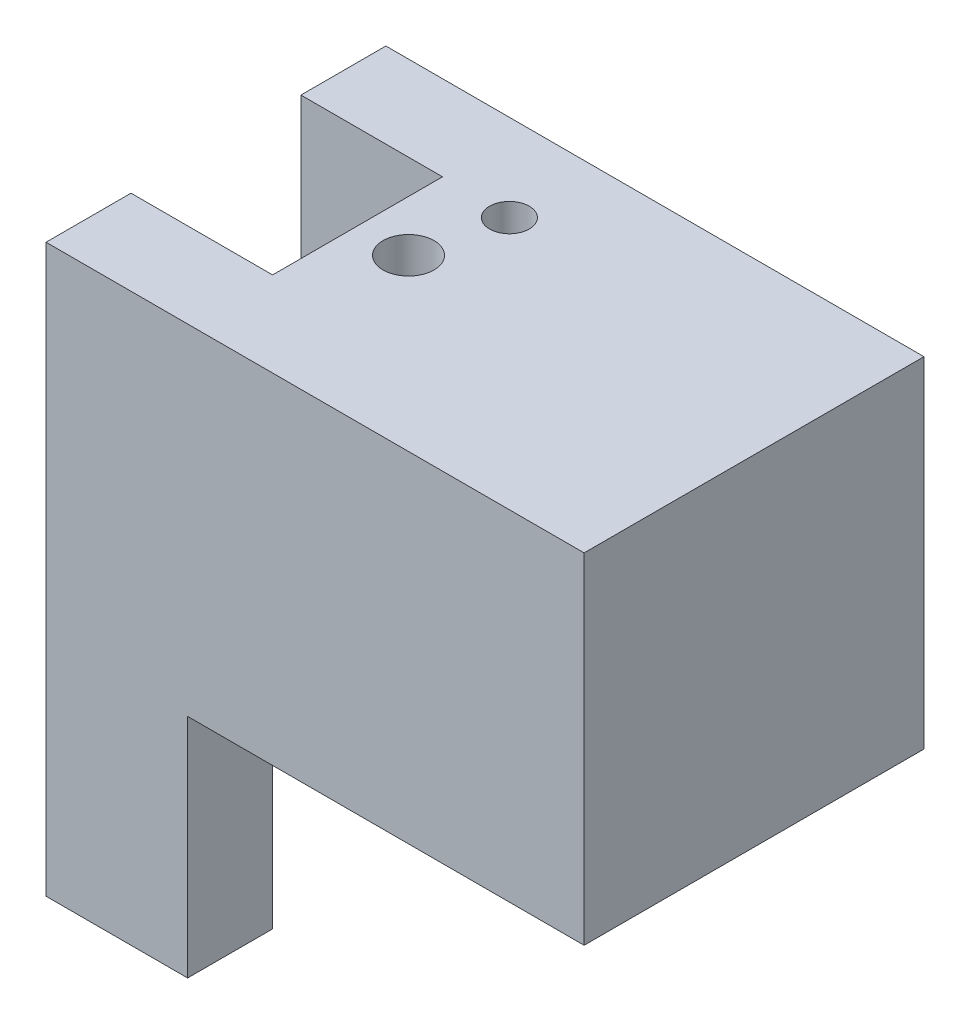
ISO-10303-21;
HEADER;
FILE_DESCRIPTION(('STEP AP214'),'2;1');
FILE_NAME('part.step','',(''),(''),'','','');
FILE_SCHEMA(('AUTOMOTIVE_DESIGN { 1 0 10303 214 1 1 1 1 }'));
ENDSEC;
DATA;
#1=APPLICATION_CONTEXT('core data for automotive mechanical design processes');
#2=APPLICATION_PROTOCOL_DEFINITION('international standard','automotive_design',2000,#1);
#3=PRODUCT_CONTEXT('',#1,'mechanical');
#4=PRODUCT('Part','Part','',(#3));
#5=PRODUCT_RELATED_PRODUCT_CATEGORY('part','',(#4));
#6=PRODUCT_DEFINITION_FORMATION('','',#4);
#7=PRODUCT_DEFINITION_CONTEXT('part definition',#1,'design');
#8=PRODUCT_DEFINITION('design','',#6,#7);
#9=PRODUCT_DEFINITION_SHAPE('','',#8);
#10=(LENGTH_UNIT() NAMED_UNIT(*) SI_UNIT(.MILLI.,.METRE.));
#11=(NAMED_UNIT(*) PLANE_ANGLE_UNIT() SI_UNIT($,.RADIAN.));
#12=(NAMED_UNIT(*) SI_UNIT($,.STERADIAN.) SOLID_ANGLE_UNIT());
#13=UNCERTAINTY_MEASURE_WITH_UNIT(LENGTH_MEASURE(1.E-05),#10,'distance_accuracy_value','');
#14=(GEOMETRIC_REPRESENTATION_CONTEXT(3) GLOBAL_UNCERTAINTY_ASSIGNED_CONTEXT((#13)) GLOBAL_UNIT_ASSIGNED_CONTEXT((#10,
#11,#12)) REPRESENTATION_CONTEXT('',''));
#15=CARTESIAN_POINT('',(0.,0.,0.));
#16=DIRECTION('',(0.,0.,1.));
#17=DIRECTION('',(1.,0.,0.));
#18=AXIS2_PLACEMENT_3D('',#15,#16,#17);
#19=CARTESIAN_POINT('',(-73.0526172288944,17.3879194630873,60.));
#20=DIRECTION('',(0.,1.,0.));
#21=DIRECTION('',(0.,0.,1.));
#22=AXIS2_PLACEMENT_3D('',#19,#20,#21);
#23=PLANE('',#22);
#24=CARTESIAN_POINT('',(-64.0526172288944,17.3879194630873,30.));
#25=DIRECTION('',(0.,-1.,0.));
#26=DIRECTION('',(0.,0.,-1.));
#27=AXIS2_PLACEMENT_3D('',#24,#25,#26);
#28=CIRCLE('',#27,4.5);
#29=CARTESIAN_POINT('',(-64.0526172288944,17.3879194630873,25.5));
#30=VERTEX_POINT('',#29);
#31=EDGE_CURVE('E270',#30,#30,#28,.T.);
#32=ORIENTED_EDGE('',*,*,#31,.F.);
#33=EDGE_LOOP('',(#32));
#34=FACE_BOUND('',#33,.T.);
#35=DIRECTION('',(0.,0.,1.));
#36=VECTOR('',#35,1.);
#37=CARTESIAN_POINT('',(-73.0526172288944,17.3879194630873,15.));
#38=LINE('',#37,#36);
#39=CARTESIAN_POINT('',(-73.0526172288944,17.3879194630873,0.));
#40=VERTEX_POINT('',#39);
#41=CARTESIAN_POINT('',(-73.0526172288944,17.3879194630873,15.));
#42=VERTEX_POINT('',#41);
#43=EDGE_CURVE('E195',#40,#42,#38,.T.);
#44=ORIENTED_EDGE('',*,*,#43,.F.);
#45=DIRECTION('',(1.,0.,0.));
#46=VECTOR('',#45,1.);
#47=CARTESIAN_POINT('',(-73.0526172288944,17.3879194630873,0.));
#48=LINE('',#47,#46);
#49=CARTESIAN_POINT('',(-3.05261722889438,17.3879194630873,0.));
#50=VERTEX_POINT('',#49);
#51=EDGE_CURVE('E67',#40,#50,#48,.T.);
#52=ORIENTED_EDGE('',*,*,#51,.T.);
#53=DIRECTION('',(0.,0.,-1.));
#54=VECTOR('',#53,1.);
#55=CARTESIAN_POINT('',(-3.05261722889438,17.3879194630873,60.));
#56=LINE('',#55,#54);
#57=CARTESIAN_POINT('',(-3.05261722889438,17.3879194630873,60.));
#58=VERTEX_POINT('',#57);
#59=EDGE_CURVE('E47',#58,#50,#56,.T.);
#60=ORIENTED_EDGE('',*,*,#59,.F.);
#61=DIRECTION('',(1.,0.,0.));
#62=VECTOR('',#61,1.);
#63=CARTESIAN_POINT('',(-73.0526172288944,17.3879194630873,60.));
#64=LINE('',#63,#62);
#65=CARTESIAN_POINT('',(-73.0526172288944,17.3879194630873,60.));
#66=VERTEX_POINT('',#65);
#67=EDGE_CURVE('E115',#66,#58,#64,.T.);
#68=ORIENTED_EDGE('',*,*,#67,.F.);
#69=DIRECTION('',(0.,0.,1.));
#70=VECTOR('',#69,1.);
#71=CARTESIAN_POINT('',(-73.0526172288944,17.3879194630873,60.));
#72=LINE('',#71,#70);
#73=CARTESIAN_POINT('',(-73.0526172288944,17.3879194630873,45.));
#74=VERTEX_POINT('',#73);
#75=EDGE_CURVE('E110',#74,#66,#72,.T.);
#76=ORIENTED_EDGE('',*,*,#75,.F.);
#77=DIRECTION('',(0.,0.,-1.));
#78=VECTOR('',#77,1.);
#79=CARTESIAN_POINT('',(-73.0526172288944,17.3879194630873,60.));
#80=LINE('',#79,#78);
#81=EDGE_CURVE('E11',#74,#42,#80,.T.);
#82=ORIENTED_EDGE('',*,*,#81,.T.);
#83=EDGE_LOOP('',(#44,#52,#60,#68,#76,#82));
#84=FACE_BOUND('',#83,.T.);
#85=ADVANCED_FACE('F37',(#34,#84),#23,.F.);
#86=CARTESIAN_POINT('',(-73.0526172288944,77.3879194630872,60.));
#87=DIRECTION('',(1.,0.,0.));
#88=DIRECTION('',(0.,1.,0.));
#89=AXIS2_PLACEMENT_3D('',#86,#87,#88);
#90=PLANE('',#89);
#91=DIRECTION('',(0.,-1.,0.));
#92=VECTOR('',#91,1.);
#93=CARTESIAN_POINT('',(-73.0526172288944,77.3879194630872,45.));
#94=LINE('',#93,#92);
#95=CARTESIAN_POINT('',(-73.0526172288944,77.3879194630872,45.));
#96=VERTEX_POINT('',#95);
#97=EDGE_CURVE('E125',#96,#74,#94,.T.);
#98=ORIENTED_EDGE('',*,*,#97,.F.);
#99=DIRECTION('',(0.,0.,-1.));
#100=VECTOR('',#99,1.);
#101=CARTESIAN_POINT('',(-73.0526172288944,77.3879194630872,60.));
#102=LINE('',#101,#100);
#103=CARTESIAN_POINT('',(-73.0526172288944,77.3879194630872,15.));
#104=VERTEX_POINT('',#103);
#105=EDGE_CURVE('E89',#96,#104,#102,.T.);
#106=ORIENTED_EDGE('',*,*,#105,.T.);
#107=DIRECTION('',(0.,1.,0.));
#108=VECTOR('',#107,1.);
#109=CARTESIAN_POINT('',(-73.0526172288944,77.3879194630872,15.));
#110=LINE('',#109,#108);
#111=EDGE_CURVE('E135',#42,#104,#110,.T.);
#112=ORIENTED_EDGE('',*,*,#111,.F.);
#113=ORIENTED_EDGE('',*,*,#81,.F.);
#114=EDGE_LOOP('',(#98,#106,#112,#113));
#115=FACE_BOUND('',#114,.T.);
#116=ADVANCED_FACE('F39',(#115),#90,.F.);
#117=CARTESIAN_POINT('',(-3.05261722889438,77.3879194630872,60.));
#118=DIRECTION('',(-1.,0.,0.));
#119=DIRECTION('',(0.,0.,1.));
#120=AXIS2_PLACEMENT_3D('',#117,#118,#119);
#121=PLANE('',#120);
#122=DIRECTION('',(0.,1.,0.));
#123=VECTOR('',#122,1.);
#124=CARTESIAN_POINT('',(-3.05261722889438,77.3879194630872,0.));
#125=LINE('',#124,#123);
#126=CARTESIAN_POINT('',(-3.05261722889438,77.3879194630872,0.));
#127=VERTEX_POINT('',#126);
#128=EDGE_CURVE('E184',#50,#127,#125,.T.);
#129=ORIENTED_EDGE('',*,*,#128,.T.);
#130=DIRECTION('',(0.,0.,-1.));
#131=VECTOR('',#130,1.);
#132=CARTESIAN_POINT('',(-3.05261722889438,77.3879194630872,60.));
#133=LINE('',#132,#131);
#134=CARTESIAN_POINT('',(-3.05261722889438,77.3879194630872,60.));
#135=VERTEX_POINT('',#134);
#136=EDGE_CURVE('E174',#135,#127,#133,.T.);
#137=ORIENTED_EDGE('',*,*,#136,.F.);
#138=DIRECTION('',(0.,1.,0.));
#139=VECTOR('',#138,1.);
#140=CARTESIAN_POINT('',(-3.05261722889438,77.3879194630872,60.));
#141=LINE('',#140,#139);
#142=EDGE_CURVE('E56',#58,#135,#141,.T.);
#143=ORIENTED_EDGE('',*,*,#142,.F.);
#144=ORIENTED_EDGE('',*,*,#59,.T.);
#145=EDGE_LOOP('',(#129,#137,#143,#144));
#146=FACE_BOUND('',#145,.T.);
#147=ADVANCED_FACE('F183',(#146),#121,.F.);
#148=CARTESIAN_POINT('',(-73.0526172288944,77.3879194630872,60.));
#149=DIRECTION('',(0.,-1.,0.));
#150=DIRECTION('',(0.,0.,-1.));
#151=AXIS2_PLACEMENT_3D('',#148,#149,#150);
#152=PLANE('',#151);
#153=CARTESIAN_POINT('',(-64.0526172288944,77.3879194630872,30.));
#154=DIRECTION('',(0.,-1.,0.));
#155=DIRECTION('',(0.,0.,-1.));
#156=AXIS2_PLACEMENT_3D('',#153,#154,#155);
#157=CIRCLE('',#156,4.5);
#158=CARTESIAN_POINT('',(-64.0526172288944,77.3879194630872,25.5));
#159=VERTEX_POINT('',#158);
#160=EDGE_CURVE('E428',#159,#159,#157,.F.);
#161=ORIENTED_EDGE('',*,*,#160,.F.);
#162=EDGE_LOOP('',(#161));
#163=FACE_BOUND('',#162,.T.);
#164=CARTESIAN_POINT('',(-60.9092010326515,77.3879194630872,15.3344850698618));
#165=DIRECTION('',(0.,1.,0.));
#166=DIRECTION('',(0.,0.,1.));
#167=AXIS2_PLACEMENT_3D('',#164,#165,#166);
#168=CIRCLE('',#167,3.5);
#169=CARTESIAN_POINT('',(-60.9092010326515,77.3879194630872,18.8344850698618));
#170=VERTEX_POINT('',#169);
#171=EDGE_CURVE('E267',#170,#170,#168,.T.);
#172=ORIENTED_EDGE('',*,*,#171,.F.);
#173=EDGE_LOOP('',(#172));
#174=FACE_BOUND('',#173,.T.);
#175=DIRECTION('',(-1.,0.,0.));
#176=VECTOR('',#175,1.);
#177=CARTESIAN_POINT('',(-73.0526172288944,77.3879194630872,0.));
#178=LINE('',#177,#176);
#179=CARTESIAN_POINT('',(-98.0526172288944,77.3879194630872,0.));
#180=VERTEX_POINT('',#179);
#181=EDGE_CURVE('E77',#127,#180,#178,.T.);
#182=ORIENTED_EDGE('',*,*,#181,.T.);
#183=DIRECTION('',(0.,0.,-1.));
#184=VECTOR('',#183,1.);
#185=CARTESIAN_POINT('',(-98.0526172288944,77.3879194630872,0.));
#186=LINE('',#185,#184);
#187=CARTESIAN_POINT('',(-98.0526172288944,77.3879194630872,15.));
#188=VERTEX_POINT('',#187);
#189=EDGE_CURVE('E157',#188,#180,#186,.T.);
#190=ORIENTED_EDGE('',*,*,#189,.F.);
#191=DIRECTION('',(1.,0.,0.));
#192=VECTOR('',#191,1.);
#193=CARTESIAN_POINT('',(-98.0526172288944,77.3879194630872,15.));
#194=LINE('',#193,#192);
#195=EDGE_CURVE('E159',#188,#104,#194,.T.);
#196=ORIENTED_EDGE('',*,*,#195,.T.);
#197=ORIENTED_EDGE('',*,*,#105,.F.);
#198=DIRECTION('',(1.,0.,0.));
#199=VECTOR('',#198,1.);
#200=CARTESIAN_POINT('',(-98.0526172288944,77.3879194630872,45.));
#201=LINE('',#200,#199);
#202=CARTESIAN_POINT('',(-98.0526172288944,77.3879194630872,45.));
#203=VERTEX_POINT('',#202);
#204=EDGE_CURVE('E132',#203,#96,#201,.T.);
#205=ORIENTED_EDGE('',*,*,#204,.F.);
#206=DIRECTION('',(0.,0.,-1.));
#207=VECTOR('',#206,1.);
#208=CARTESIAN_POINT('',(-98.0526172288944,77.3879194630872,60.));
#209=LINE('',#208,#207);
#210=CARTESIAN_POINT('',(-98.0526172288944,77.3879194630872,60.));
#211=VERTEX_POINT('',#210);
#212=EDGE_CURVE('E98',#211,#203,#209,.T.);
#213=ORIENTED_EDGE('',*,*,#212,.F.);
#214=DIRECTION('',(-1.,0.,0.));
#215=VECTOR('',#214,1.);
#216=CARTESIAN_POINT('',(-73.0526172288944,77.3879194630872,60.));
#217=LINE('',#216,#215);
#218=EDGE_CURVE('E175',#135,#211,#217,.T.);
#219=ORIENTED_EDGE('',*,*,#218,.F.);
#220=ORIENTED_EDGE('',*,*,#136,.T.);
#221=EDGE_LOOP('',(#182,#190,#196,#197,#205,#213,#219,#220));
#222=FACE_BOUND('',#221,.T.);
#223=ADVANCED_FACE('F297',(#163,#174,#222),#152,.F.);
#224=CARTESIAN_POINT('',(-73.0526172288944,17.3879194630873,60.));
#225=DIRECTION('',(0.,0.,1.));
#226=DIRECTION('',(1.,0.,0.));
#227=AXIS2_PLACEMENT_3D('',#224,#225,#226);
#228=PLANE('',#227);
#229=ORIENTED_EDGE('',*,*,#218,.T.);
#230=DIRECTION('',(0.,1.,0.));
#231=VECTOR('',#230,1.);
#232=CARTESIAN_POINT('',(-98.0526172288944,77.3879194630872,60.));
#233=LINE('',#232,#231);
#234=CARTESIAN_POINT('',(-98.0526172288944,-22.6120805369127,60.));
#235=VERTEX_POINT('',#234);
#236=EDGE_CURVE('E133',#235,#211,#233,.T.);
#237=ORIENTED_EDGE('',*,*,#236,.F.);
#238=DIRECTION('',(-1.,0.,0.));
#239=VECTOR('',#238,1.);
#240=CARTESIAN_POINT('',(-98.0526172288944,-22.6120805369127,60.));
#241=LINE('',#240,#239);
#242=CARTESIAN_POINT('',(-73.0526172288944,-22.6120805369127,60.));
#243=VERTEX_POINT('',#242);
#244=EDGE_CURVE('E141',#243,#235,#241,.T.);
#245=ORIENTED_EDGE('',*,*,#244,.F.);
#246=DIRECTION('',(0.,1.,0.));
#247=VECTOR('',#246,1.);
#248=CARTESIAN_POINT('',(-73.0526172288944,-22.6120805369127,60.));
#249=LINE('',#248,#247);
#250=EDGE_CURVE('E139',#243,#66,#249,.T.);
#251=ORIENTED_EDGE('',*,*,#250,.T.);
#252=ORIENTED_EDGE('',*,*,#67,.T.);
#253=ORIENTED_EDGE('',*,*,#142,.T.);
#254=EDGE_LOOP('',(#229,#237,#245,#251,#252,#253));
#255=FACE_BOUND('',#254,.T.);
#256=ADVANCED_FACE('F285',(#255),#228,.T.);
#257=CARTESIAN_POINT('',(-73.0526172288944,17.3879194630873,0.));
#258=DIRECTION('',(0.,0.,1.));
#259=DIRECTION('',(1.,0.,0.));
#260=AXIS2_PLACEMENT_3D('',#257,#258,#259);
#261=PLANE('',#260);
#262=ORIENTED_EDGE('',*,*,#51,.F.);
#263=DIRECTION('',(0.,1.,0.));
#264=VECTOR('',#263,1.);
#265=CARTESIAN_POINT('',(-73.0526172288944,-22.6120805369127,0.));
#266=LINE('',#265,#264);
#267=CARTESIAN_POINT('',(-73.0526172288944,-22.6120805369127,0.));
#268=VERTEX_POINT('',#267);
#269=EDGE_CURVE('E121',#268,#40,#266,.T.);
#270=ORIENTED_EDGE('',*,*,#269,.F.);
#271=DIRECTION('',(1.,0.,0.));
#272=VECTOR('',#271,1.);
#273=CARTESIAN_POINT('',(-98.0526172288944,-22.6120805369127,0.));
#274=LINE('',#273,#272);
#275=CARTESIAN_POINT('',(-98.0526172288944,-22.6120805369127,0.));
#276=VERTEX_POINT('',#275);
#277=EDGE_CURVE('E217',#276,#268,#274,.T.);
#278=ORIENTED_EDGE('',*,*,#277,.F.);
#279=DIRECTION('',(0.,-1.,0.));
#280=VECTOR('',#279,1.);
#281=CARTESIAN_POINT('',(-98.0526172288944,77.3879194630872,0.));
#282=LINE('',#281,#280);
#283=EDGE_CURVE('E152',#180,#276,#282,.T.);
#284=ORIENTED_EDGE('',*,*,#283,.F.);
#285=ORIENTED_EDGE('',*,*,#181,.F.);
#286=ORIENTED_EDGE('',*,*,#128,.F.);
#287=EDGE_LOOP('',(#262,#270,#278,#284,#285,#286));
#288=FACE_BOUND('',#287,.T.);
#289=ADVANCED_FACE('F186',(#288),#261,.F.);
#290=CARTESIAN_POINT('',(-98.0526172288944,77.3879194630872,15.));
#291=DIRECTION('',(0.,0.,-1.));
#292=DIRECTION('',(0.,1.,0.));
#293=AXIS2_PLACEMENT_3D('',#290,#291,#292);
#294=PLANE('',#293);
#295=ORIENTED_EDGE('',*,*,#111,.T.);
#296=ORIENTED_EDGE('',*,*,#195,.F.);
#297=DIRECTION('',(0.,1.,0.));
#298=VECTOR('',#297,1.);
#299=CARTESIAN_POINT('',(-98.0526172288944,77.3879194630872,15.));
#300=LINE('',#299,#298);
#301=CARTESIAN_POINT('',(-98.0526172288944,-22.6120805369127,15.));
#302=VERTEX_POINT('',#301);
#303=EDGE_CURVE('E155',#302,#188,#300,.T.);
#304=ORIENTED_EDGE('',*,*,#303,.F.);
#305=DIRECTION('',(-1.,0.,0.));
#306=VECTOR('',#305,1.);
#307=CARTESIAN_POINT('',(-98.0526172288944,-22.6120805369127,15.));
#308=LINE('',#307,#306);
#309=CARTESIAN_POINT('',(-73.0526172288944,-22.6120805369127,15.));
#310=VERTEX_POINT('',#309);
#311=EDGE_CURVE('E203',#310,#302,#308,.T.);
#312=ORIENTED_EDGE('',*,*,#311,.F.);
#313=DIRECTION('',(0.,1.,0.));
#314=VECTOR('',#313,1.);
#315=CARTESIAN_POINT('',(-73.0526172288944,-22.6120805369127,15.));
#316=LINE('',#315,#314);
#317=EDGE_CURVE('E201',#310,#42,#316,.T.);
#318=ORIENTED_EDGE('',*,*,#317,.T.);
#319=EDGE_LOOP('',(#295,#296,#304,#312,#318));
#320=FACE_BOUND('',#319,.T.);
#321=ADVANCED_FACE('F276',(#320),#294,.F.);
#322=CARTESIAN_POINT('',(-98.0526172288944,17.3879194630872,0.));
#323=DIRECTION('',(-1.,0.,0.));
#324=DIRECTION('',(0.,-1.,0.));
#325=AXIS2_PLACEMENT_3D('',#322,#323,#324);
#326=PLANE('',#325);
#327=ORIENTED_EDGE('',*,*,#283,.T.);
#328=DIRECTION('',(0.,0.,-1.));
#329=VECTOR('',#328,1.);
#330=CARTESIAN_POINT('',(-98.0526172288944,-22.6120805369127,15.));
#331=LINE('',#330,#329);
#332=EDGE_CURVE('E198',#302,#276,#331,.T.);
#333=ORIENTED_EDGE('',*,*,#332,.F.);
#334=ORIENTED_EDGE('',*,*,#303,.T.);
#335=ORIENTED_EDGE('',*,*,#189,.T.);
#336=EDGE_LOOP('',(#327,#333,#334,#335));
#337=FACE_BOUND('',#336,.T.);
#338=ADVANCED_FACE('F278',(#337),#326,.T.);
#339=CARTESIAN_POINT('',(-98.0526172288944,77.3879194630872,45.));
#340=DIRECTION('',(0.,0.,1.));
#341=DIRECTION('',(0.,-1.,0.));
#342=AXIS2_PLACEMENT_3D('',#339,#340,#341);
#343=PLANE('',#342);
#344=ORIENTED_EDGE('',*,*,#97,.T.);
#345=DIRECTION('',(0.,1.,0.));
#346=VECTOR('',#345,1.);
#347=CARTESIAN_POINT('',(-73.0526172288944,-22.6120805369127,45.));
#348=LINE('',#347,#346);
#349=CARTESIAN_POINT('',(-73.0526172288944,-22.6120805369127,45.));
#350=VERTEX_POINT('',#349);
#351=EDGE_CURVE('E129',#350,#74,#348,.T.);
#352=ORIENTED_EDGE('',*,*,#351,.F.);
#353=DIRECTION('',(1.,0.,0.));
#354=VECTOR('',#353,1.);
#355=CARTESIAN_POINT('',(-98.0526172288944,-22.6120805369127,45.));
#356=LINE('',#355,#354);
#357=CARTESIAN_POINT('',(-98.0526172288944,-22.6120805369127,45.));
#358=VERTEX_POINT('',#357);
#359=EDGE_CURVE('E223',#358,#350,#356,.T.);
#360=ORIENTED_EDGE('',*,*,#359,.F.);
#361=DIRECTION('',(0.,-1.,0.));
#362=VECTOR('',#361,1.);
#363=CARTESIAN_POINT('',(-98.0526172288944,77.3879194630872,45.));
#364=LINE('',#363,#362);
#365=EDGE_CURVE('E149',#203,#358,#364,.T.);
#366=ORIENTED_EDGE('',*,*,#365,.F.);
#367=ORIENTED_EDGE('',*,*,#204,.T.);
#368=EDGE_LOOP('',(#344,#352,#360,#366,#367));
#369=FACE_BOUND('',#368,.T.);
#370=ADVANCED_FACE('F126',(#369),#343,.F.);
#371=CARTESIAN_POINT('',(-98.0526172288944,17.3879194630872,60.));
#372=DIRECTION('',(1.,0.,0.));
#373=DIRECTION('',(0.,1.,0.));
#374=AXIS2_PLACEMENT_3D('',#371,#372,#373);
#375=PLANE('',#374);
#376=ORIENTED_EDGE('',*,*,#236,.T.);
#377=ORIENTED_EDGE('',*,*,#212,.T.);
#378=ORIENTED_EDGE('',*,*,#365,.T.);
#379=DIRECTION('',(0.,0.,-1.));
#380=VECTOR('',#379,1.);
#381=CARTESIAN_POINT('',(-98.0526172288944,-22.6120805369127,60.));
#382=LINE('',#381,#380);
#383=EDGE_CURVE('E120',#235,#358,#382,.T.);
#384=ORIENTED_EDGE('',*,*,#383,.F.);
#385=EDGE_LOOP('',(#376,#377,#378,#384));
#386=FACE_BOUND('',#385,.T.);
#387=ADVANCED_FACE('F235',(#386),#375,.F.);
#388=CARTESIAN_POINT('',(-73.0526172288944,-22.6120805369127,60.));
#389=DIRECTION('',(-1.,0.,0.));
#390=DIRECTION('',(0.,0.,1.));
#391=AXIS2_PLACEMENT_3D('',#388,#389,#390);
#392=PLANE('',#391);
#393=ORIENTED_EDGE('',*,*,#75,.T.);
#394=ORIENTED_EDGE('',*,*,#250,.F.);
#395=DIRECTION('',(0.,0.,1.));
#396=VECTOR('',#395,1.);
#397=CARTESIAN_POINT('',(-73.0526172288944,-22.6120805369127,60.));
#398=LINE('',#397,#396);
#399=EDGE_CURVE('E138',#350,#243,#398,.T.);
#400=ORIENTED_EDGE('',*,*,#399,.F.);
#401=ORIENTED_EDGE('',*,*,#351,.T.);
#402=EDGE_LOOP('',(#393,#394,#400,#401));
#403=FACE_BOUND('',#402,.T.);
#404=ADVANCED_FACE('F136',(#403),#392,.F.);
#405=CARTESIAN_POINT('',(-98.0526172288944,-22.6120805369127,45.));
#406=DIRECTION('',(0.,-1.,0.));
#407=DIRECTION('',(0.,0.,-1.));
#408=AXIS2_PLACEMENT_3D('',#405,#406,#407);
#409=PLANE('',#408);
#410=ORIENTED_EDGE('',*,*,#383,.T.);
#411=ORIENTED_EDGE('',*,*,#359,.T.);
#412=ORIENTED_EDGE('',*,*,#399,.T.);
#413=ORIENTED_EDGE('',*,*,#244,.T.);
#414=EDGE_LOOP('',(#410,#411,#412,#413));
#415=FACE_BOUND('',#414,.T.);
#416=ADVANCED_FACE('F230',(#415),#409,.T.);
#417=CARTESIAN_POINT('',(-73.0526172288944,-22.6120805369127,15.));
#418=DIRECTION('',(-1.,0.,0.));
#419=DIRECTION('',(0.,0.,1.));
#420=AXIS2_PLACEMENT_3D('',#417,#418,#419);
#421=PLANE('',#420);
#422=ORIENTED_EDGE('',*,*,#43,.T.);
#423=ORIENTED_EDGE('',*,*,#317,.F.);
#424=DIRECTION('',(0.,0.,1.));
#425=VECTOR('',#424,1.);
#426=CARTESIAN_POINT('',(-73.0526172288944,-22.6120805369127,15.));
#427=LINE('',#426,#425);
#428=EDGE_CURVE('E210',#268,#310,#427,.T.);
#429=ORIENTED_EDGE('',*,*,#428,.F.);
#430=ORIENTED_EDGE('',*,*,#269,.T.);
#431=EDGE_LOOP('',(#422,#423,#429,#430));
#432=FACE_BOUND('',#431,.T.);
#433=ADVANCED_FACE('F275',(#432),#421,.F.);
#434=CARTESIAN_POINT('',(-98.0526172288944,-22.6120805369127,0.));
#435=DIRECTION('',(0.,-1.,0.));
#436=DIRECTION('',(0.,0.,-1.));
#437=AXIS2_PLACEMENT_3D('',#434,#435,#436);
#438=PLANE('',#437);
#439=ORIENTED_EDGE('',*,*,#332,.T.);
#440=ORIENTED_EDGE('',*,*,#277,.T.);
#441=ORIENTED_EDGE('',*,*,#428,.T.);
#442=ORIENTED_EDGE('',*,*,#311,.T.);
#443=EDGE_LOOP('',(#439,#440,#441,#442));
#444=FACE_BOUND('',#443,.T.);
#445=ADVANCED_FACE('F262',(#444),#438,.T.);
#446=CARTESIAN_POINT('',(-60.9092010326515,56.3879194630872,15.3344850698618));
#447=DIRECTION('',(0.,1.,0.));
#448=DIRECTION('',(0.,0.,1.));
#449=AXIS2_PLACEMENT_3D('',#446,#447,#448);
#450=CONICAL_SURFACE('',#449,3.5,1.02974425867665);
#451=CARTESIAN_POINT('',(-60.9092010326515,54.2849072964908,15.3344850698618));
#452=VERTEX_POINT('',#451);
#453=VERTEX_LOOP('',#452);
#454=FACE_BOUND('',#453,.T.);
#455=CARTESIAN_POINT('',(-60.9092010326515,56.3879194630872,15.3344850698618));
#456=DIRECTION('',(0.,1.,0.));
#457=DIRECTION('',(0.,0.,1.));
#458=AXIS2_PLACEMENT_3D('',#455,#456,#457);
#459=CIRCLE('',#458,3.5);
#460=CARTESIAN_POINT('',(-60.9092010326515,56.3879194630872,18.8344850698618));
#461=VERTEX_POINT('',#460);
#462=EDGE_CURVE('E199',#461,#461,#459,.T.);
#463=ORIENTED_EDGE('',*,*,#462,.T.);
#464=EDGE_LOOP('',(#463));
#465=FACE_BOUND('',#464,.T.);
#466=ADVANCED_FACE('F258',(#454,#465),#450,.F.);
#467=CARTESIAN_POINT('',(-60.9092010326515,77.3879194630872,15.3344850698618));
#468=DIRECTION('',(0.,1.,0.));
#469=DIRECTION('',(0.,0.,1.));
#470=AXIS2_PLACEMENT_3D('',#467,#468,#469);
#471=CYLINDRICAL_SURFACE('',#470,3.5);
#472=ORIENTED_EDGE('',*,*,#462,.F.);
#473=EDGE_LOOP('',(#472));
#474=FACE_BOUND('',#473,.T.);
#475=ORIENTED_EDGE('',*,*,#171,.T.);
#476=EDGE_LOOP('',(#475));
#477=FACE_BOUND('',#476,.T.);
#478=ADVANCED_FACE('F261',(#474,#477),#471,.F.);
#479=CARTESIAN_POINT('',(-64.0526172288944,17.3879194630873,30.));
#480=DIRECTION('',(0.,-1.,0.));
#481=DIRECTION('',(0.,0.,-1.));
#482=AXIS2_PLACEMENT_3D('',#479,#480,#481);
#483=CYLINDRICAL_SURFACE('',#482,4.5);
#484=ORIENTED_EDGE('',*,*,#31,.T.);
#485=EDGE_LOOP('',(#484));
#486=FACE_BOUND('',#485,.T.);
#487=ORIENTED_EDGE('',*,*,#160,.T.);
#488=EDGE_LOOP('',(#487));
#489=FACE_BOUND('',#488,.T.);
#490=ADVANCED_FACE('F389',(#486,#489),#483,.F.);
#491=CLOSED_SHELL('',(#85,#116,#147,#223,#256,#289,#321,#338,#370,#387,#404,#416,#433,#445,#466,
#478,#490));
#492=MANIFOLD_SOLID_BREP('B2',#491);
#493=ADVANCED_BREP_SHAPE_REPRESENTATION('',(#18,#492),#14);
#494=SHAPE_DEFINITION_REPRESENTATION(#9,#493);
ENDSEC;
END-ISO-10303-21;
